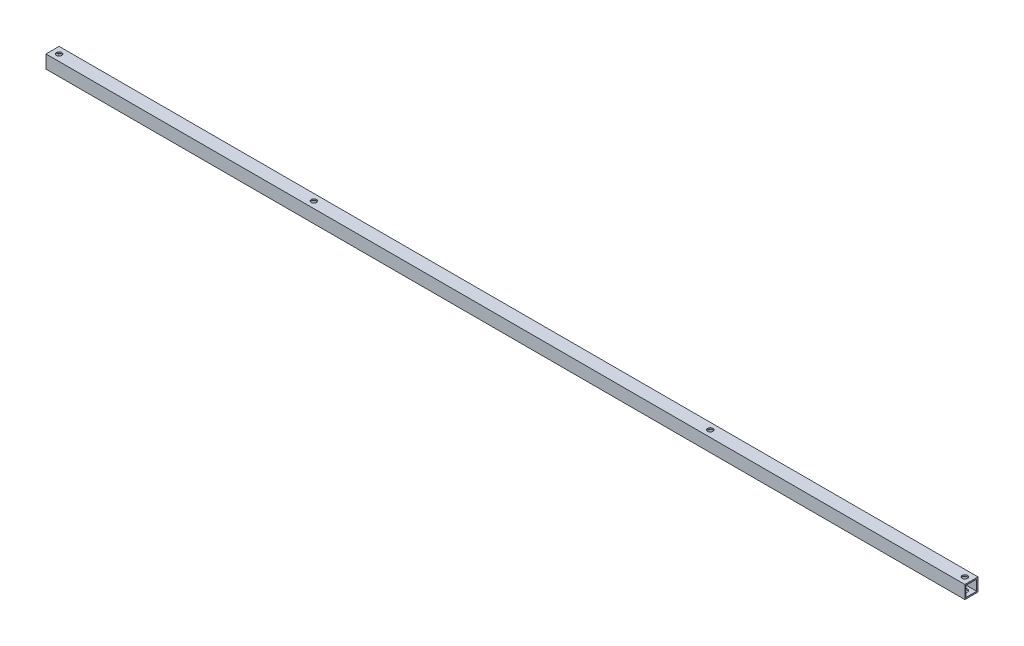
ISO-10303-21;
HEADER;
FILE_DESCRIPTION(('STEP AP214'),'2;1');
FILE_NAME('part.step','',(''),(''),'','','');
FILE_SCHEMA(('AUTOMOTIVE_DESIGN { 1 0 10303 214 1 1 1 1 }'));
ENDSEC;
DATA;
#1=APPLICATION_CONTEXT('core data for automotive mechanical design processes');
#2=APPLICATION_PROTOCOL_DEFINITION('international standard','automotive_design',2000,#1);
#3=PRODUCT_CONTEXT('',#1,'mechanical');
#4=PRODUCT('Part','Part','',(#3));
#5=PRODUCT_RELATED_PRODUCT_CATEGORY('part','',(#4));
#6=PRODUCT_DEFINITION_FORMATION('','',#4);
#7=PRODUCT_DEFINITION_CONTEXT('part definition',#1,'design');
#8=PRODUCT_DEFINITION('design','',#6,#7);
#9=PRODUCT_DEFINITION_SHAPE('','',#8);
#10=(LENGTH_UNIT() NAMED_UNIT(*) SI_UNIT(.MILLI.,.METRE.));
#11=(NAMED_UNIT(*) PLANE_ANGLE_UNIT() SI_UNIT($,.RADIAN.));
#12=(NAMED_UNIT(*) SI_UNIT($,.STERADIAN.) SOLID_ANGLE_UNIT());
#13=UNCERTAINTY_MEASURE_WITH_UNIT(LENGTH_MEASURE(1.E-05),#10,'distance_accuracy_value','');
#14=(GEOMETRIC_REPRESENTATION_CONTEXT(3) GLOBAL_UNCERTAINTY_ASSIGNED_CONTEXT((#13)) GLOBAL_UNIT_ASSIGNED_CONTEXT((#10,
#11,#12)) REPRESENTATION_CONTEXT('',''));
#15=CARTESIAN_POINT('',(0.,0.,0.));
#16=DIRECTION('',(0.,0.,1.));
#17=DIRECTION('',(1.,0.,0.));
#18=AXIS2_PLACEMENT_3D('',#15,#16,#17);
#19=CARTESIAN_POINT('',(700.,0.,0.));
#20=DIRECTION('',(1.,0.,0.));
#21=DIRECTION('',(0.,0.,-1.));
#22=AXIS2_PLACEMENT_3D('',#19,#20,#21);
#23=PLANE('',#22);
#24=DIRECTION('',(0.,1.,0.));
#25=VECTOR('',#24,1.);
#26=CARTESIAN_POINT('',(700.,5.,-5.));
#27=LINE('',#26,#25);
#28=CARTESIAN_POINT('',(700.,-5.,-5.));
#29=VERTEX_POINT('',#28);
#30=CARTESIAN_POINT('',(700.,5.,-5.));
#31=VERTEX_POINT('',#30);
#32=EDGE_CURVE('E164',#29,#31,#27,.T.);
#33=ORIENTED_EDGE('',*,*,#32,.T.);
#34=DIRECTION('',(0.,0.,1.));
#35=VECTOR('',#34,1.);
#36=CARTESIAN_POINT('',(700.,5.,5.));
#37=LINE('',#36,#35);
#38=CARTESIAN_POINT('',(700.,5.,5.));
#39=VERTEX_POINT('',#38);
#40=EDGE_CURVE('E167',#31,#39,#37,.T.);
#41=ORIENTED_EDGE('',*,*,#40,.T.);
#42=DIRECTION('',(0.,-1.,0.));
#43=VECTOR('',#42,1.);
#44=CARTESIAN_POINT('',(700.,5.,5.));
#45=LINE('',#44,#43);
#46=CARTESIAN_POINT('',(700.,-5.,5.));
#47=VERTEX_POINT('',#46);
#48=EDGE_CURVE('E170',#39,#47,#45,.T.);
#49=ORIENTED_EDGE('',*,*,#48,.T.);
#50=DIRECTION('',(0.,0.,-1.));
#51=VECTOR('',#50,1.);
#52=CARTESIAN_POINT('',(700.,-5.,5.));
#53=LINE('',#52,#51);
#54=EDGE_CURVE('E172',#47,#29,#53,.T.);
#55=ORIENTED_EDGE('',*,*,#54,.T.);
#56=EDGE_LOOP('',(#33,#41,#49,#55));
#57=FACE_BOUND('',#56,.T.);
#58=DIRECTION('',(0.,0.,1.));
#59=VECTOR('',#58,1.);
#60=CARTESIAN_POINT('',(700.,4.,5.));
#61=LINE('',#60,#59);
#62=CARTESIAN_POINT('',(700.,4.,-4.));
#63=VERTEX_POINT('',#62);
#64=CARTESIAN_POINT('',(700.,4.,4.));
#65=VERTEX_POINT('',#64);
#66=EDGE_CURVE('E134',#63,#65,#61,.T.);
#67=ORIENTED_EDGE('',*,*,#66,.F.);
#68=DIRECTION('',(0.,1.,0.));
#69=VECTOR('',#68,1.);
#70=CARTESIAN_POINT('',(700.,5.,-4.));
#71=LINE('',#70,#69);
#72=CARTESIAN_POINT('',(700.,-4.,-4.));
#73=VERTEX_POINT('',#72);
#74=EDGE_CURVE('E126',#73,#63,#71,.T.);
#75=ORIENTED_EDGE('',*,*,#74,.F.);
#76=DIRECTION('',(0.,0.,-1.));
#77=VECTOR('',#76,1.);
#78=CARTESIAN_POINT('',(700.,-4.,5.));
#79=LINE('',#78,#77);
#80=CARTESIAN_POINT('',(700.,-4.,4.));
#81=VERTEX_POINT('',#80);
#82=EDGE_CURVE('E148',#81,#73,#79,.T.);
#83=ORIENTED_EDGE('',*,*,#82,.F.);
#84=DIRECTION('',(0.,-1.,0.));
#85=VECTOR('',#84,1.);
#86=CARTESIAN_POINT('',(700.,5.,4.));
#87=LINE('',#86,#85);
#88=EDGE_CURVE('E146',#65,#81,#87,.T.);
#89=ORIENTED_EDGE('',*,*,#88,.F.);
#90=EDGE_LOOP('',(#67,#75,#83,#89));
#91=FACE_BOUND('',#90,.T.);
#92=ADVANCED_FACE('F59',(#57,#91),#23,.T.);
#93=CARTESIAN_POINT('',(0.,0.,0.));
#94=DIRECTION('',(1.,0.,0.));
#95=DIRECTION('',(0.,0.,-1.));
#96=AXIS2_PLACEMENT_3D('',#93,#94,#95);
#97=PLANE('',#96);
#98=DIRECTION('',(0.,1.,0.));
#99=VECTOR('',#98,1.);
#100=CARTESIAN_POINT('',(0.,5.,-5.));
#101=LINE('',#100,#99);
#102=CARTESIAN_POINT('',(0.,-5.,-5.));
#103=VERTEX_POINT('',#102);
#104=CARTESIAN_POINT('',(0.,5.,-5.));
#105=VERTEX_POINT('',#104);
#106=EDGE_CURVE('E142',#103,#105,#101,.T.);
#107=ORIENTED_EDGE('',*,*,#106,.F.);
#108=DIRECTION('',(0.,0.,-1.));
#109=VECTOR('',#108,1.);
#110=CARTESIAN_POINT('',(0.,-5.,5.));
#111=LINE('',#110,#109);
#112=CARTESIAN_POINT('',(0.,-5.,5.));
#113=VERTEX_POINT('',#112);
#114=EDGE_CURVE('E168',#113,#103,#111,.T.);
#115=ORIENTED_EDGE('',*,*,#114,.F.);
#116=DIRECTION('',(0.,-1.,0.));
#117=VECTOR('',#116,1.);
#118=CARTESIAN_POINT('',(0.,5.,5.));
#119=LINE('',#118,#117);
#120=CARTESIAN_POINT('',(0.,5.,5.));
#121=VERTEX_POINT('',#120);
#122=EDGE_CURVE('E179',#121,#113,#119,.T.);
#123=ORIENTED_EDGE('',*,*,#122,.F.);
#124=DIRECTION('',(0.,0.,1.));
#125=VECTOR('',#124,1.);
#126=CARTESIAN_POINT('',(0.,5.,5.));
#127=LINE('',#126,#125);
#128=EDGE_CURVE('E177',#105,#121,#127,.T.);
#129=ORIENTED_EDGE('',*,*,#128,.F.);
#130=EDGE_LOOP('',(#107,#115,#123,#129));
#131=FACE_BOUND('',#130,.T.);
#132=DIRECTION('',(0.,1.,0.));
#133=VECTOR('',#132,1.);
#134=CARTESIAN_POINT('',(0.,5.,-4.));
#135=LINE('',#134,#133);
#136=CARTESIAN_POINT('',(0.,-4.,-4.));
#137=VERTEX_POINT('',#136);
#138=CARTESIAN_POINT('',(0.,4.,-4.));
#139=VERTEX_POINT('',#138);
#140=EDGE_CURVE('E84',#137,#139,#135,.T.);
#141=ORIENTED_EDGE('',*,*,#140,.T.);
#142=DIRECTION('',(0.,0.,1.));
#143=VECTOR('',#142,1.);
#144=CARTESIAN_POINT('',(0.,4.,5.));
#145=LINE('',#144,#143);
#146=CARTESIAN_POINT('',(0.,4.,4.));
#147=VERTEX_POINT('',#146);
#148=EDGE_CURVE('E141',#139,#147,#145,.T.);
#149=ORIENTED_EDGE('',*,*,#148,.T.);
#150=DIRECTION('',(0.,-1.,0.));
#151=VECTOR('',#150,1.);
#152=CARTESIAN_POINT('',(0.,5.,4.));
#153=LINE('',#152,#151);
#154=CARTESIAN_POINT('',(0.,-4.,4.));
#155=VERTEX_POINT('',#154);
#156=EDGE_CURVE('E156',#147,#155,#153,.T.);
#157=ORIENTED_EDGE('',*,*,#156,.T.);
#158=DIRECTION('',(0.,0.,-1.));
#159=VECTOR('',#158,1.);
#160=CARTESIAN_POINT('',(0.,-4.,5.));
#161=LINE('',#160,#159);
#162=EDGE_CURVE('E135',#155,#137,#161,.T.);
#163=ORIENTED_EDGE('',*,*,#162,.T.);
#164=EDGE_LOOP('',(#141,#149,#157,#163));
#165=FACE_BOUND('',#164,.T.);
#166=ADVANCED_FACE('F231',(#131,#165),#97,.F.);
#167=CARTESIAN_POINT('',(700.,5.,-5.));
#168=DIRECTION('',(0.,0.,1.));
#169=DIRECTION('',(0.,-1.,0.));
#170=AXIS2_PLACEMENT_3D('',#167,#168,#169);
#171=PLANE('',#170);
#172=ORIENTED_EDGE('',*,*,#106,.T.);
#173=DIRECTION('',(-1.,0.,0.));
#174=VECTOR('',#173,1.);
#175=CARTESIAN_POINT('',(700.,5.,-5.));
#176=LINE('',#175,#174);
#177=EDGE_CURVE('E12',#31,#105,#176,.T.);
#178=ORIENTED_EDGE('',*,*,#177,.F.);
#179=ORIENTED_EDGE('',*,*,#32,.F.);
#180=DIRECTION('',(-1.,0.,0.));
#181=VECTOR('',#180,1.);
#182=CARTESIAN_POINT('',(700.,-5.,-5.));
#183=LINE('',#182,#181);
#184=EDGE_CURVE('E174',#29,#103,#183,.T.);
#185=ORIENTED_EDGE('',*,*,#184,.T.);
#186=EDGE_LOOP('',(#172,#178,#179,#185));
#187=FACE_BOUND('',#186,.T.);
#188=ADVANCED_FACE('F61',(#187),#171,.F.);
#189=CARTESIAN_POINT('',(700.,5.,5.));
#190=DIRECTION('',(0.,-1.,0.));
#191=DIRECTION('',(0.,0.,-1.));
#192=AXIS2_PLACEMENT_3D('',#189,#190,#191);
#193=PLANE('',#192);
#194=CARTESIAN_POINT('',(695.,5.,0.));
#195=DIRECTION('',(0.,1.,0.));
#196=DIRECTION('',(0.,0.,1.));
#197=AXIS2_PLACEMENT_3D('',#194,#195,#196);
#198=CIRCLE('',#197,2.);
#199=CARTESIAN_POINT('',(695.,5.,2.));
#200=VERTEX_POINT('',#199);
#201=EDGE_CURVE('E267',#200,#200,#198,.T.);
#202=ORIENTED_EDGE('',*,*,#201,.F.);
#203=EDGE_LOOP('',(#202));
#204=FACE_BOUND('',#203,.T.);
#205=CARTESIAN_POINT('',(199.,5.,0.));
#206=DIRECTION('',(0.,1.,0.));
#207=DIRECTION('',(0.,0.,-1.));
#208=AXIS2_PLACEMENT_3D('',#205,#206,#207);
#209=CIRCLE('',#208,2.);
#210=CARTESIAN_POINT('',(199.,5.,-1.99999999999996));
#211=VERTEX_POINT('',#210);
#212=EDGE_CURVE('E271',#211,#211,#209,.T.);
#213=ORIENTED_EDGE('',*,*,#212,.F.);
#214=EDGE_LOOP('',(#213));
#215=FACE_BOUND('',#214,.T.);
#216=CARTESIAN_POINT('',(501.,5.,0.));
#217=DIRECTION('',(0.,1.,0.));
#218=DIRECTION('',(0.,0.,1.));
#219=AXIS2_PLACEMENT_3D('',#216,#217,#218);
#220=CIRCLE('',#219,2.);
#221=CARTESIAN_POINT('',(501.,5.,2.));
#222=VERTEX_POINT('',#221);
#223=EDGE_CURVE('E275',#222,#222,#220,.T.);
#224=ORIENTED_EDGE('',*,*,#223,.F.);
#225=EDGE_LOOP('',(#224));
#226=FACE_BOUND('',#225,.T.);
#227=CARTESIAN_POINT('',(5.,5.,0.));
#228=DIRECTION('',(0.,1.,0.));
#229=DIRECTION('',(0.,0.,-1.));
#230=AXIS2_PLACEMENT_3D('',#227,#228,#229);
#231=CIRCLE('',#230,2.);
#232=CARTESIAN_POINT('',(5.,5.,-2.));
#233=VERTEX_POINT('',#232);
#234=EDGE_CURVE('E279',#233,#233,#231,.T.);
#235=ORIENTED_EDGE('',*,*,#234,.F.);
#236=EDGE_LOOP('',(#235));
#237=FACE_BOUND('',#236,.T.);
#238=ORIENTED_EDGE('',*,*,#128,.T.);
#239=DIRECTION('',(-1.,0.,0.));
#240=VECTOR('',#239,1.);
#241=CARTESIAN_POINT('',(700.,5.,5.));
#242=LINE('',#241,#240);
#243=EDGE_CURVE('E68',#39,#121,#242,.T.);
#244=ORIENTED_EDGE('',*,*,#243,.F.);
#245=ORIENTED_EDGE('',*,*,#40,.F.);
#246=ORIENTED_EDGE('',*,*,#177,.T.);
#247=EDGE_LOOP('',(#238,#244,#245,#246));
#248=FACE_BOUND('',#247,.T.);
#249=ADVANCED_FACE('F256',(#204,#215,#226,#237,#248),#193,.F.);
#250=CARTESIAN_POINT('',(700.,5.,5.));
#251=DIRECTION('',(0.,0.,-1.));
#252=DIRECTION('',(0.,1.,0.));
#253=AXIS2_PLACEMENT_3D('',#250,#251,#252);
#254=PLANE('',#253);
#255=ORIENTED_EDGE('',*,*,#122,.T.);
#256=DIRECTION('',(-1.,0.,0.));
#257=VECTOR('',#256,1.);
#258=CARTESIAN_POINT('',(700.,-5.,5.));
#259=LINE('',#258,#257);
#260=EDGE_CURVE('E184',#47,#113,#259,.T.);
#261=ORIENTED_EDGE('',*,*,#260,.F.);
#262=ORIENTED_EDGE('',*,*,#48,.F.);
#263=ORIENTED_EDGE('',*,*,#243,.T.);
#264=EDGE_LOOP('',(#255,#261,#262,#263));
#265=FACE_BOUND('',#264,.T.);
#266=ADVANCED_FACE('F253',(#265),#254,.F.);
#267=CARTESIAN_POINT('',(700.,-5.,5.));
#268=DIRECTION('',(0.,1.,0.));
#269=DIRECTION('',(0.,0.,1.));
#270=AXIS2_PLACEMENT_3D('',#267,#268,#269);
#271=PLANE('',#270);
#272=CARTESIAN_POINT('',(695.,-5.,0.));
#273=DIRECTION('',(0.,1.,0.));
#274=DIRECTION('',(0.,0.,1.));
#275=AXIS2_PLACEMENT_3D('',#272,#273,#274);
#276=CIRCLE('',#275,2.);
#277=CARTESIAN_POINT('',(695.,-5.,2.));
#278=VERTEX_POINT('',#277);
#279=EDGE_CURVE('E193',#278,#278,#276,.T.);
#280=ORIENTED_EDGE('',*,*,#279,.T.);
#281=EDGE_LOOP('',(#280));
#282=FACE_BOUND('',#281,.T.);
#283=CARTESIAN_POINT('',(199.,-5.,0.));
#284=DIRECTION('',(0.,1.,0.));
#285=DIRECTION('',(0.,0.,-1.));
#286=AXIS2_PLACEMENT_3D('',#283,#284,#285);
#287=CIRCLE('',#286,2.);
#288=CARTESIAN_POINT('',(199.,-5.,-1.99999999999996));
#289=VERTEX_POINT('',#288);
#290=EDGE_CURVE('E300',#289,#289,#287,.T.);
#291=ORIENTED_EDGE('',*,*,#290,.T.);
#292=EDGE_LOOP('',(#291));
#293=FACE_BOUND('',#292,.T.);
#294=CARTESIAN_POINT('',(501.,-5.,0.));
#295=DIRECTION('',(0.,1.,0.));
#296=DIRECTION('',(0.,0.,1.));
#297=AXIS2_PLACEMENT_3D('',#294,#295,#296);
#298=CIRCLE('',#297,2.);
#299=CARTESIAN_POINT('',(501.,-5.,2.));
#300=VERTEX_POINT('',#299);
#301=EDGE_CURVE('E293',#300,#300,#298,.T.);
#302=ORIENTED_EDGE('',*,*,#301,.T.);
#303=EDGE_LOOP('',(#302));
#304=FACE_BOUND('',#303,.T.);
#305=CARTESIAN_POINT('',(5.,-5.,0.));
#306=DIRECTION('',(0.,1.,0.));
#307=DIRECTION('',(0.,0.,-1.));
#308=AXIS2_PLACEMENT_3D('',#305,#306,#307);
#309=CIRCLE('',#308,2.);
#310=CARTESIAN_POINT('',(5.,-5.,-2.));
#311=VERTEX_POINT('',#310);
#312=EDGE_CURVE('E292',#311,#311,#309,.T.);
#313=ORIENTED_EDGE('',*,*,#312,.T.);
#314=EDGE_LOOP('',(#313));
#315=FACE_BOUND('',#314,.T.);
#316=ORIENTED_EDGE('',*,*,#114,.T.);
#317=ORIENTED_EDGE('',*,*,#184,.F.);
#318=ORIENTED_EDGE('',*,*,#54,.F.);
#319=ORIENTED_EDGE('',*,*,#260,.T.);
#320=EDGE_LOOP('',(#316,#317,#318,#319));
#321=FACE_BOUND('',#320,.T.);
#322=ADVANCED_FACE('F250',(#282,#293,#304,#315,#321),#271,.F.);
#323=CARTESIAN_POINT('',(700.,5.,-4.));
#324=DIRECTION('',(0.,0.,1.));
#325=DIRECTION('',(0.,-1.,0.));
#326=AXIS2_PLACEMENT_3D('',#323,#324,#325);
#327=PLANE('',#326);
#328=ORIENTED_EDGE('',*,*,#140,.F.);
#329=DIRECTION('',(-1.,0.,0.));
#330=VECTOR('',#329,1.);
#331=CARTESIAN_POINT('',(700.,-4.,-4.));
#332=LINE('',#331,#330);
#333=EDGE_CURVE('E130',#73,#137,#332,.T.);
#334=ORIENTED_EDGE('',*,*,#333,.F.);
#335=ORIENTED_EDGE('',*,*,#74,.T.);
#336=DIRECTION('',(-1.,0.,0.));
#337=VECTOR('',#336,1.);
#338=CARTESIAN_POINT('',(700.,4.,-4.));
#339=LINE('',#338,#337);
#340=EDGE_CURVE('E129',#63,#139,#339,.T.);
#341=ORIENTED_EDGE('',*,*,#340,.T.);
#342=EDGE_LOOP('',(#328,#334,#335,#341));
#343=FACE_BOUND('',#342,.T.);
#344=ADVANCED_FACE('F128',(#343),#327,.T.);
#345=CARTESIAN_POINT('',(700.,4.,5.));
#346=DIRECTION('',(0.,-1.,0.));
#347=DIRECTION('',(0.,0.,-1.));
#348=AXIS2_PLACEMENT_3D('',#345,#346,#347);
#349=PLANE('',#348);
#350=CARTESIAN_POINT('',(695.,4.,0.));
#351=DIRECTION('',(0.,-1.,0.));
#352=DIRECTION('',(0.,0.,-1.));
#353=AXIS2_PLACEMENT_3D('',#350,#351,#352);
#354=CIRCLE('',#353,2.);
#355=CARTESIAN_POINT('',(695.,4.,-2.));
#356=VERTEX_POINT('',#355);
#357=EDGE_CURVE('E154',#356,#356,#354,.T.);
#358=ORIENTED_EDGE('',*,*,#357,.F.);
#359=EDGE_LOOP('',(#358));
#360=FACE_BOUND('',#359,.T.);
#361=CARTESIAN_POINT('',(199.,4.,0.));
#362=DIRECTION('',(0.,-1.,0.));
#363=DIRECTION('',(0.,0.,-1.));
#364=AXIS2_PLACEMENT_3D('',#361,#362,#363);
#365=CIRCLE('',#364,2.);
#366=CARTESIAN_POINT('',(199.,4.,-1.99999999999996));
#367=VERTEX_POINT('',#366);
#368=EDGE_CURVE('E199',#367,#367,#365,.T.);
#369=ORIENTED_EDGE('',*,*,#368,.F.);
#370=EDGE_LOOP('',(#369));
#371=FACE_BOUND('',#370,.T.);
#372=CARTESIAN_POINT('',(501.,4.,0.));
#373=DIRECTION('',(0.,-1.,0.));
#374=DIRECTION('',(0.,0.,-1.));
#375=AXIS2_PLACEMENT_3D('',#372,#373,#374);
#376=CIRCLE('',#375,2.);
#377=CARTESIAN_POINT('',(501.,4.,-2.));
#378=VERTEX_POINT('',#377);
#379=EDGE_CURVE('E196',#378,#378,#376,.T.);
#380=ORIENTED_EDGE('',*,*,#379,.F.);
#381=EDGE_LOOP('',(#380));
#382=FACE_BOUND('',#381,.T.);
#383=CARTESIAN_POINT('',(5.,4.,0.));
#384=DIRECTION('',(0.,-1.,0.));
#385=DIRECTION('',(0.,0.,-1.));
#386=AXIS2_PLACEMENT_3D('',#383,#384,#385);
#387=CIRCLE('',#386,2.);
#388=CARTESIAN_POINT('',(5.,4.,-2.));
#389=VERTEX_POINT('',#388);
#390=EDGE_CURVE('E192',#389,#389,#387,.T.);
#391=ORIENTED_EDGE('',*,*,#390,.F.);
#392=EDGE_LOOP('',(#391));
#393=FACE_BOUND('',#392,.T.);
#394=ORIENTED_EDGE('',*,*,#148,.F.);
#395=ORIENTED_EDGE('',*,*,#340,.F.);
#396=ORIENTED_EDGE('',*,*,#66,.T.);
#397=DIRECTION('',(-1.,0.,0.));
#398=VECTOR('',#397,1.);
#399=CARTESIAN_POINT('',(700.,4.,4.));
#400=LINE('',#399,#398);
#401=EDGE_CURVE('E143',#65,#147,#400,.T.);
#402=ORIENTED_EDGE('',*,*,#401,.T.);
#403=EDGE_LOOP('',(#394,#395,#396,#402));
#404=FACE_BOUND('',#403,.T.);
#405=ADVANCED_FACE('F138',(#360,#371,#382,#393,#404),#349,.T.);
#406=CARTESIAN_POINT('',(700.,5.,4.));
#407=DIRECTION('',(0.,0.,-1.));
#408=DIRECTION('',(0.,1.,0.));
#409=AXIS2_PLACEMENT_3D('',#406,#407,#408);
#410=PLANE('',#409);
#411=ORIENTED_EDGE('',*,*,#156,.F.);
#412=ORIENTED_EDGE('',*,*,#401,.F.);
#413=ORIENTED_EDGE('',*,*,#88,.T.);
#414=DIRECTION('',(-1.,0.,0.));
#415=VECTOR('',#414,1.);
#416=CARTESIAN_POINT('',(700.,-4.,4.));
#417=LINE('',#416,#415);
#418=EDGE_CURVE('E76',#81,#155,#417,.T.);
#419=ORIENTED_EDGE('',*,*,#418,.T.);
#420=EDGE_LOOP('',(#411,#412,#413,#419));
#421=FACE_BOUND('',#420,.T.);
#422=ADVANCED_FACE('F223',(#421),#410,.T.);
#423=CARTESIAN_POINT('',(700.,-4.,5.));
#424=DIRECTION('',(0.,1.,0.));
#425=DIRECTION('',(0.,0.,1.));
#426=AXIS2_PLACEMENT_3D('',#423,#424,#425);
#427=PLANE('',#426);
#428=CARTESIAN_POINT('',(695.,-4.,0.));
#429=DIRECTION('',(0.,1.,0.));
#430=DIRECTION('',(0.,0.,1.));
#431=AXIS2_PLACEMENT_3D('',#428,#429,#430);
#432=CIRCLE('',#431,2.);
#433=CARTESIAN_POINT('',(695.,-4.,2.));
#434=VERTEX_POINT('',#433);
#435=EDGE_CURVE('E63',#434,#434,#432,.T.);
#436=ORIENTED_EDGE('',*,*,#435,.F.);
#437=EDGE_LOOP('',(#436));
#438=FACE_BOUND('',#437,.T.);
#439=CARTESIAN_POINT('',(199.,-4.,0.));
#440=DIRECTION('',(0.,1.,0.));
#441=DIRECTION('',(0.,0.,1.));
#442=AXIS2_PLACEMENT_3D('',#439,#440,#441);
#443=CIRCLE('',#442,2.);
#444=CARTESIAN_POINT('',(199.,-4.,2.00000000000003));
#445=VERTEX_POINT('',#444);
#446=EDGE_CURVE('E197',#445,#445,#443,.T.);
#447=ORIENTED_EDGE('',*,*,#446,.F.);
#448=EDGE_LOOP('',(#447));
#449=FACE_BOUND('',#448,.T.);
#450=CARTESIAN_POINT('',(501.,-4.,0.));
#451=DIRECTION('',(0.,1.,0.));
#452=DIRECTION('',(0.,0.,1.));
#453=AXIS2_PLACEMENT_3D('',#450,#451,#452);
#454=CIRCLE('',#453,2.);
#455=CARTESIAN_POINT('',(501.,-4.,2.));
#456=VERTEX_POINT('',#455);
#457=EDGE_CURVE('E194',#456,#456,#454,.T.);
#458=ORIENTED_EDGE('',*,*,#457,.F.);
#459=EDGE_LOOP('',(#458));
#460=FACE_BOUND('',#459,.T.);
#461=CARTESIAN_POINT('',(5.,-4.,0.));
#462=DIRECTION('',(0.,1.,0.));
#463=DIRECTION('',(0.,0.,1.));
#464=AXIS2_PLACEMENT_3D('',#461,#462,#463);
#465=CIRCLE('',#464,2.);
#466=CARTESIAN_POINT('',(5.,-4.,2.));
#467=VERTEX_POINT('',#466);
#468=EDGE_CURVE('E189',#467,#467,#465,.T.);
#469=ORIENTED_EDGE('',*,*,#468,.F.);
#470=EDGE_LOOP('',(#469));
#471=FACE_BOUND('',#470,.T.);
#472=ORIENTED_EDGE('',*,*,#162,.F.);
#473=ORIENTED_EDGE('',*,*,#418,.F.);
#474=ORIENTED_EDGE('',*,*,#82,.T.);
#475=ORIENTED_EDGE('',*,*,#333,.T.);
#476=EDGE_LOOP('',(#472,#473,#474,#475));
#477=FACE_BOUND('',#476,.T.);
#478=ADVANCED_FACE('F219',(#438,#449,#460,#471,#477),#427,.T.);
#479=CARTESIAN_POINT('',(5.,-5.,0.));
#480=DIRECTION('',(0.,1.,0.));
#481=DIRECTION('',(0.,0.,1.));
#482=AXIS2_PLACEMENT_3D('',#479,#480,#481);
#483=CYLINDRICAL_SURFACE('',#482,2.);
#484=ORIENTED_EDGE('',*,*,#468,.T.);
#485=EDGE_LOOP('',(#484));
#486=FACE_BOUND('',#485,.T.);
#487=ORIENTED_EDGE('',*,*,#312,.F.);
#488=EDGE_LOOP('',(#487));
#489=FACE_BOUND('',#488,.T.);
#490=ADVANCED_FACE('F222',(#486,#489),#483,.F.);
#491=CARTESIAN_POINT('',(501.,-5.,0.));
#492=DIRECTION('',(0.,1.,0.));
#493=DIRECTION('',(0.,0.,1.));
#494=AXIS2_PLACEMENT_3D('',#491,#492,#493);
#495=CYLINDRICAL_SURFACE('',#494,2.);
#496=ORIENTED_EDGE('',*,*,#457,.T.);
#497=EDGE_LOOP('',(#496));
#498=FACE_BOUND('',#497,.T.);
#499=ORIENTED_EDGE('',*,*,#301,.F.);
#500=EDGE_LOOP('',(#499));
#501=FACE_BOUND('',#500,.T.);
#502=ADVANCED_FACE('F322',(#498,#501),#495,.F.);
#503=CARTESIAN_POINT('',(199.,-5.,0.));
#504=DIRECTION('',(0.,1.,0.));
#505=DIRECTION('',(0.,0.,1.));
#506=AXIS2_PLACEMENT_3D('',#503,#504,#505);
#507=CYLINDRICAL_SURFACE('',#506,2.);
#508=ORIENTED_EDGE('',*,*,#446,.T.);
#509=EDGE_LOOP('',(#508));
#510=FACE_BOUND('',#509,.T.);
#511=ORIENTED_EDGE('',*,*,#290,.F.);
#512=EDGE_LOOP('',(#511));
#513=FACE_BOUND('',#512,.T.);
#514=ADVANCED_FACE('F312',(#510,#513),#507,.F.);
#515=CARTESIAN_POINT('',(695.,-5.,0.));
#516=DIRECTION('',(0.,1.,0.));
#517=DIRECTION('',(0.,0.,1.));
#518=AXIS2_PLACEMENT_3D('',#515,#516,#517);
#519=CYLINDRICAL_SURFACE('',#518,2.);
#520=ORIENTED_EDGE('',*,*,#435,.T.);
#521=EDGE_LOOP('',(#520));
#522=FACE_BOUND('',#521,.T.);
#523=ORIENTED_EDGE('',*,*,#279,.F.);
#524=EDGE_LOOP('',(#523));
#525=FACE_BOUND('',#524,.T.);
#526=ADVANCED_FACE('F216',(#522,#525),#519,.F.);
#527=ORIENTED_EDGE('',*,*,#390,.T.);
#528=EDGE_LOOP('',(#527));
#529=FACE_BOUND('',#528,.T.);
#530=ORIENTED_EDGE('',*,*,#234,.T.);
#531=EDGE_LOOP('',(#530));
#532=FACE_BOUND('',#531,.T.);
#533=ADVANCED_FACE('F311',(#529,#532),#483,.F.);
#534=ORIENTED_EDGE('',*,*,#379,.T.);
#535=EDGE_LOOP('',(#534));
#536=FACE_BOUND('',#535,.T.);
#537=ORIENTED_EDGE('',*,*,#223,.T.);
#538=EDGE_LOOP('',(#537));
#539=FACE_BOUND('',#538,.T.);
#540=ADVANCED_FACE('F319',(#536,#539),#495,.F.);
#541=ORIENTED_EDGE('',*,*,#368,.T.);
#542=EDGE_LOOP('',(#541));
#543=FACE_BOUND('',#542,.T.);
#544=ORIENTED_EDGE('',*,*,#212,.T.);
#545=EDGE_LOOP('',(#544));
#546=FACE_BOUND('',#545,.T.);
#547=ADVANCED_FACE('F324',(#543,#546),#507,.F.);
#548=ORIENTED_EDGE('',*,*,#357,.T.);
#549=EDGE_LOOP('',(#548));
#550=FACE_BOUND('',#549,.T.);
#551=ORIENTED_EDGE('',*,*,#201,.T.);
#552=EDGE_LOOP('',(#551));
#553=FACE_BOUND('',#552,.T.);
#554=ADVANCED_FACE('F314',(#550,#553),#519,.F.);
#555=CLOSED_SHELL('',(#92,#166,#188,#249,#266,#322,#344,#405,#422,#478,#490,#502,#514,#526,#533,
#540,#547,#554));
#556=MANIFOLD_SOLID_BREP('B2',#555);
#557=ADVANCED_BREP_SHAPE_REPRESENTATION('',(#18,#556),#14);
#558=SHAPE_DEFINITION_REPRESENTATION(#9,#557);
ENDSEC;
END-ISO-10303-21;
